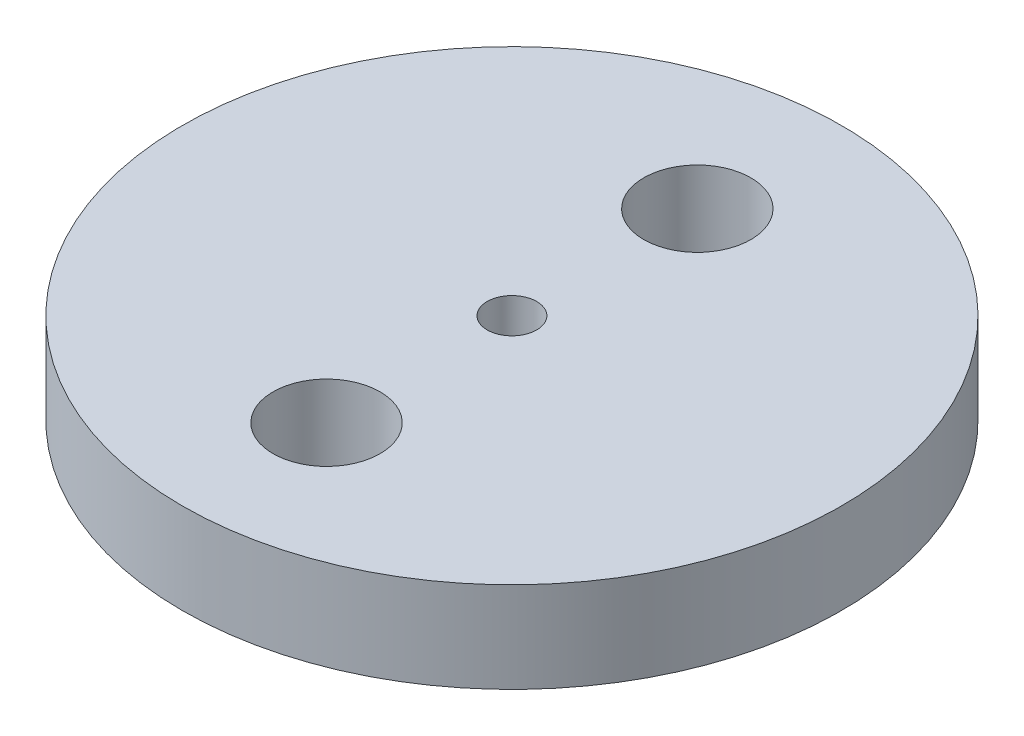
ISO-10303-21;
HEADER;
FILE_DESCRIPTION(('STEP AP214'),'2;1');
FILE_NAME('part.step','',(''),(''),'','','');
FILE_SCHEMA(('AUTOMOTIVE_DESIGN { 1 0 10303 214 1 1 1 1 }'));
ENDSEC;
DATA;
#1=APPLICATION_CONTEXT('core data for automotive mechanical design processes');
#2=APPLICATION_PROTOCOL_DEFINITION('international standard','automotive_design',2000,#1);
#3=PRODUCT_CONTEXT('',#1,'mechanical');
#4=PRODUCT('Part','Part','',(#3));
#5=PRODUCT_RELATED_PRODUCT_CATEGORY('part','',(#4));
#6=PRODUCT_DEFINITION_FORMATION('','',#4);
#7=PRODUCT_DEFINITION_CONTEXT('part definition',#1,'design');
#8=PRODUCT_DEFINITION('design','',#6,#7);
#9=PRODUCT_DEFINITION_SHAPE('','',#8);
#10=(LENGTH_UNIT() NAMED_UNIT(*) SI_UNIT(.MILLI.,.METRE.));
#11=(NAMED_UNIT(*) PLANE_ANGLE_UNIT() SI_UNIT($,.RADIAN.));
#12=(NAMED_UNIT(*) SI_UNIT($,.STERADIAN.) SOLID_ANGLE_UNIT());
#13=UNCERTAINTY_MEASURE_WITH_UNIT(LENGTH_MEASURE(1.E-05),#10,'distance_accuracy_value','');
#14=(GEOMETRIC_REPRESENTATION_CONTEXT(3) GLOBAL_UNCERTAINTY_ASSIGNED_CONTEXT((#13)) GLOBAL_UNIT_ASSIGNED_CONTEXT((#10,
#11,#12)) REPRESENTATION_CONTEXT('',''));
#15=CARTESIAN_POINT('',(0.,0.,0.));
#16=DIRECTION('',(0.,0.,1.));
#17=DIRECTION('',(1.,0.,0.));
#18=AXIS2_PLACEMENT_3D('',#15,#16,#17);
#19=CARTESIAN_POINT('',(0.,2.2,0.));
#20=DIRECTION('',(0.,-1.,0.));
#21=DIRECTION('',(0.,0.,-1.));
#22=AXIS2_PLACEMENT_3D('',#19,#20,#21);
#23=CYLINDRICAL_SURFACE('',#22,8.);
#24=CARTESIAN_POINT('',(0.,2.2,0.));
#25=DIRECTION('',(0.,1.,0.));
#26=DIRECTION('',(0.,0.,1.));
#27=AXIS2_PLACEMENT_3D('',#24,#25,#26);
#28=CIRCLE('',#27,8.);
#29=CARTESIAN_POINT('',(0.,2.2,8.));
#30=VERTEX_POINT('',#29);
#31=EDGE_CURVE('E43',#30,#30,#28,.T.);
#32=ORIENTED_EDGE('',*,*,#31,.F.);
#33=EDGE_LOOP('',(#32));
#34=FACE_BOUND('',#33,.T.);
#35=CARTESIAN_POINT('',(0.,0.,0.));
#36=DIRECTION('',(0.,1.,0.));
#37=DIRECTION('',(0.,0.,1.));
#38=AXIS2_PLACEMENT_3D('',#35,#36,#37);
#39=CIRCLE('',#38,8.);
#40=CARTESIAN_POINT('',(0.,0.,8.));
#41=VERTEX_POINT('',#40);
#42=EDGE_CURVE('E47',#41,#41,#39,.T.);
#43=ORIENTED_EDGE('',*,*,#42,.T.);
#44=EDGE_LOOP('',(#43));
#45=FACE_BOUND('',#44,.T.);
#46=ADVANCED_FACE('F37',(#34,#45),#23,.T.);
#47=CARTESIAN_POINT('',(0.,2.2,0.));
#48=DIRECTION('',(0.,1.,0.));
#49=DIRECTION('',(0.,0.,1.));
#50=AXIS2_PLACEMENT_3D('',#47,#48,#49);
#51=PLANE('',#50);
#52=CARTESIAN_POINT('',(0.,2.2,0.));
#53=DIRECTION('',(0.,1.,0.));
#54=DIRECTION('',(0.,0.,1.));
#55=AXIS2_PLACEMENT_3D('',#52,#53,#54);
#56=CIRCLE('',#55,0.6);
#57=CARTESIAN_POINT('',(0.,2.2,0.6));
#58=VERTEX_POINT('',#57);
#59=EDGE_CURVE('E72',#58,#58,#56,.F.);
#60=ORIENTED_EDGE('',*,*,#59,.T.);
#61=EDGE_LOOP('',(#60));
#62=FACE_BOUND('',#61,.T.);
#63=CARTESIAN_POINT('',(0.,2.2,4.50000000000001));
#64=DIRECTION('',(0.,1.,0.));
#65=DIRECTION('',(0.,0.,-1.));
#66=AXIS2_PLACEMENT_3D('',#63,#64,#65);
#67=CIRCLE('',#66,1.3);
#68=CARTESIAN_POINT('',(0.,2.2,3.20000000000001));
#69=VERTEX_POINT('',#68);
#70=EDGE_CURVE('E61',#69,#69,#67,.T.);
#71=ORIENTED_EDGE('',*,*,#70,.F.);
#72=EDGE_LOOP('',(#71));
#73=FACE_BOUND('',#72,.T.);
#74=CARTESIAN_POINT('',(0.,2.2,-4.5));
#75=DIRECTION('',(0.,1.,0.));
#76=DIRECTION('',(0.,0.,1.));
#77=AXIS2_PLACEMENT_3D('',#74,#75,#76);
#78=CIRCLE('',#77,1.3);
#79=CARTESIAN_POINT('',(0.,2.2,-3.2));
#80=VERTEX_POINT('',#79);
#81=EDGE_CURVE('E54',#80,#80,#78,.T.);
#82=ORIENTED_EDGE('',*,*,#81,.F.);
#83=EDGE_LOOP('',(#82));
#84=FACE_BOUND('',#83,.T.);
#85=ORIENTED_EDGE('',*,*,#31,.T.);
#86=EDGE_LOOP('',(#85));
#87=FACE_BOUND('',#86,.T.);
#88=ADVANCED_FACE('F105',(#62,#73,#84,#87),#51,.T.);
#89=CARTESIAN_POINT('',(0.,0.,0.));
#90=DIRECTION('',(0.,1.,0.));
#91=DIRECTION('',(0.,0.,1.));
#92=AXIS2_PLACEMENT_3D('',#89,#90,#91);
#93=PLANE('',#92);
#94=CARTESIAN_POINT('',(0.,0.,0.));
#95=DIRECTION('',(0.,1.,0.));
#96=DIRECTION('',(0.,0.,1.));
#97=AXIS2_PLACEMENT_3D('',#94,#95,#96);
#98=CIRCLE('',#97,3.);
#99=CARTESIAN_POINT('',(0.,0.,3.));
#100=VERTEX_POINT('',#99);
#101=EDGE_CURVE('E10',#100,#100,#98,.F.);
#102=ORIENTED_EDGE('',*,*,#101,.F.);
#103=EDGE_LOOP('',(#102));
#104=FACE_BOUND('',#103,.T.);
#105=CARTESIAN_POINT('',(0.,0.,4.50000000000001));
#106=DIRECTION('',(0.,1.,0.));
#107=DIRECTION('',(0.,0.,-1.));
#108=AXIS2_PLACEMENT_3D('',#105,#106,#107);
#109=CIRCLE('',#108,1.3);
#110=CARTESIAN_POINT('',(0.,0.,3.20000000000001));
#111=VERTEX_POINT('',#110);
#112=EDGE_CURVE('E52',#111,#111,#109,.T.);
#113=ORIENTED_EDGE('',*,*,#112,.T.);
#114=EDGE_LOOP('',(#113));
#115=FACE_BOUND('',#114,.T.);
#116=CARTESIAN_POINT('',(0.,0.,-4.5));
#117=DIRECTION('',(0.,1.,0.));
#118=DIRECTION('',(0.,0.,1.));
#119=AXIS2_PLACEMENT_3D('',#116,#117,#118);
#120=CIRCLE('',#119,1.3);
#121=CARTESIAN_POINT('',(0.,0.,-3.2));
#122=VERTEX_POINT('',#121);
#123=EDGE_CURVE('E57',#122,#122,#120,.T.);
#124=ORIENTED_EDGE('',*,*,#123,.T.);
#125=EDGE_LOOP('',(#124));
#126=FACE_BOUND('',#125,.T.);
#127=ORIENTED_EDGE('',*,*,#42,.F.);
#128=EDGE_LOOP('',(#127));
#129=FACE_BOUND('',#128,.T.);
#130=ADVANCED_FACE('F88',(#104,#115,#126,#129),#93,.F.);
#131=CARTESIAN_POINT('',(0.,0.,-4.5));
#132=DIRECTION('',(0.,1.,0.));
#133=DIRECTION('',(0.,0.,1.));
#134=AXIS2_PLACEMENT_3D('',#131,#132,#133);
#135=CYLINDRICAL_SURFACE('',#134,1.3);
#136=ORIENTED_EDGE('',*,*,#123,.F.);
#137=EDGE_LOOP('',(#136));
#138=FACE_BOUND('',#137,.T.);
#139=ORIENTED_EDGE('',*,*,#81,.T.);
#140=EDGE_LOOP('',(#139));
#141=FACE_BOUND('',#140,.T.);
#142=ADVANCED_FACE('F116',(#138,#141),#135,.F.);
#143=CARTESIAN_POINT('',(0.,0.,4.50000000000001));
#144=DIRECTION('',(0.,1.,0.));
#145=DIRECTION('',(0.,0.,1.));
#146=AXIS2_PLACEMENT_3D('',#143,#144,#145);
#147=CYLINDRICAL_SURFACE('',#146,1.3);
#148=ORIENTED_EDGE('',*,*,#112,.F.);
#149=EDGE_LOOP('',(#148));
#150=FACE_BOUND('',#149,.T.);
#151=ORIENTED_EDGE('',*,*,#70,.T.);
#152=EDGE_LOOP('',(#151));
#153=FACE_BOUND('',#152,.T.);
#154=ADVANCED_FACE('F122',(#150,#153),#147,.F.);
#155=CARTESIAN_POINT('',(0.,-2.2,0.));
#156=DIRECTION('',(0.,-1.,0.));
#157=DIRECTION('',(0.,0.,-1.));
#158=AXIS2_PLACEMENT_3D('',#155,#156,#157);
#159=PLANE('',#158);
#160=CARTESIAN_POINT('',(0.,-2.2,0.));
#161=DIRECTION('',(0.,-1.,0.));
#162=DIRECTION('',(0.,0.,-1.));
#163=AXIS2_PLACEMENT_3D('',#160,#161,#162);
#164=CIRCLE('',#163,3.);
#165=CARTESIAN_POINT('',(0.,-2.2,-3.));
#166=VERTEX_POINT('',#165);
#167=EDGE_CURVE('E58',#166,#166,#164,.T.);
#168=ORIENTED_EDGE('',*,*,#167,.T.);
#169=EDGE_LOOP('',(#168));
#170=FACE_BOUND('',#169,.T.);
#171=CARTESIAN_POINT('',(0.,-2.2,0.));
#172=DIRECTION('',(0.,-1.,0.));
#173=DIRECTION('',(0.,0.,-1.));
#174=AXIS2_PLACEMENT_3D('',#171,#172,#173);
#175=CIRCLE('',#174,2.45);
#176=CARTESIAN_POINT('',(0.,-2.2,-2.45));
#177=VERTEX_POINT('',#176);
#178=EDGE_CURVE('E68',#177,#177,#175,.T.);
#179=ORIENTED_EDGE('',*,*,#178,.F.);
#180=EDGE_LOOP('',(#179));
#181=FACE_BOUND('',#180,.T.);
#182=ADVANCED_FACE('F99',(#170,#181),#159,.T.);
#183=CARTESIAN_POINT('',(0.,-2.2,0.));
#184=DIRECTION('',(0.,1.,0.));
#185=DIRECTION('',(0.,0.,1.));
#186=AXIS2_PLACEMENT_3D('',#183,#184,#185);
#187=CYLINDRICAL_SURFACE('',#186,3.);
#188=ORIENTED_EDGE('',*,*,#167,.F.);
#189=EDGE_LOOP('',(#188));
#190=FACE_BOUND('',#189,.T.);
#191=ORIENTED_EDGE('',*,*,#101,.T.);
#192=EDGE_LOOP('',(#191));
#193=FACE_BOUND('',#192,.T.);
#194=ADVANCED_FACE('F92',(#190,#193),#187,.T.);
#195=CARTESIAN_POINT('',(0.,-2.2,0.));
#196=DIRECTION('',(0.,1.,0.));
#197=DIRECTION('',(0.,0.,1.));
#198=AXIS2_PLACEMENT_3D('',#195,#196,#197);
#199=CYLINDRICAL_SURFACE('',#198,2.45);
#200=ORIENTED_EDGE('',*,*,#178,.T.);
#201=EDGE_LOOP('',(#200));
#202=FACE_BOUND('',#201,.T.);
#203=CARTESIAN_POINT('',(0.,0.,0.));
#204=DIRECTION('',(0.,-1.,0.));
#205=DIRECTION('',(0.,0.,-1.));
#206=AXIS2_PLACEMENT_3D('',#203,#204,#205);
#207=CIRCLE('',#206,2.45);
#208=CARTESIAN_POINT('',(0.,0.,-2.45));
#209=VERTEX_POINT('',#208);
#210=EDGE_CURVE('E69',#209,#209,#207,.T.);
#211=ORIENTED_EDGE('',*,*,#210,.F.);
#212=EDGE_LOOP('',(#211));
#213=FACE_BOUND('',#212,.T.);
#214=ADVANCED_FACE('F87',(#202,#213),#199,.F.);
#215=CARTESIAN_POINT('',(0.,0.,0.));
#216=DIRECTION('',(0.,-1.,0.));
#217=DIRECTION('',(0.,0.,-1.));
#218=AXIS2_PLACEMENT_3D('',#215,#216,#217);
#219=CIRCLE('',#218,0.6);
#220=CARTESIAN_POINT('',(0.,0.,-0.6));
#221=VERTEX_POINT('',#220);
#222=EDGE_CURVE('E77',#221,#221,#219,.T.);
#223=ORIENTED_EDGE('',*,*,#222,.F.);
#224=EDGE_LOOP('',(#223));
#225=FACE_BOUND('',#224,.T.);
#226=ORIENTED_EDGE('',*,*,#210,.T.);
#227=EDGE_LOOP('',(#226));
#228=FACE_BOUND('',#227,.T.);
#229=ADVANCED_FACE('F84',(#225,#228),#93,.F.);
#230=CARTESIAN_POINT('',(0.,3.89705627484771,0.));
#231=DIRECTION('',(0.,-1.,0.));
#232=DIRECTION('',(0.,0.,-1.));
#233=AXIS2_PLACEMENT_3D('',#230,#231,#232);
#234=CYLINDRICAL_SURFACE('',#233,0.6);
#235=ORIENTED_EDGE('',*,*,#222,.T.);
#236=EDGE_LOOP('',(#235));
#237=FACE_BOUND('',#236,.T.);
#238=ORIENTED_EDGE('',*,*,#59,.F.);
#239=EDGE_LOOP('',(#238));
#240=FACE_BOUND('',#239,.T.);
#241=ADVANCED_FACE('F81',(#237,#240),#234,.F.);
#242=CLOSED_SHELL('',(#46,#88,#130,#142,#154,#182,#194,#214,#229,#241));
#243=MANIFOLD_SOLID_BREP('B2',#242);
#244=ADVANCED_BREP_SHAPE_REPRESENTATION('',(#18,#243),#14);
#245=SHAPE_DEFINITION_REPRESENTATION(#9,#244);
ENDSEC;
END-ISO-10303-21;
